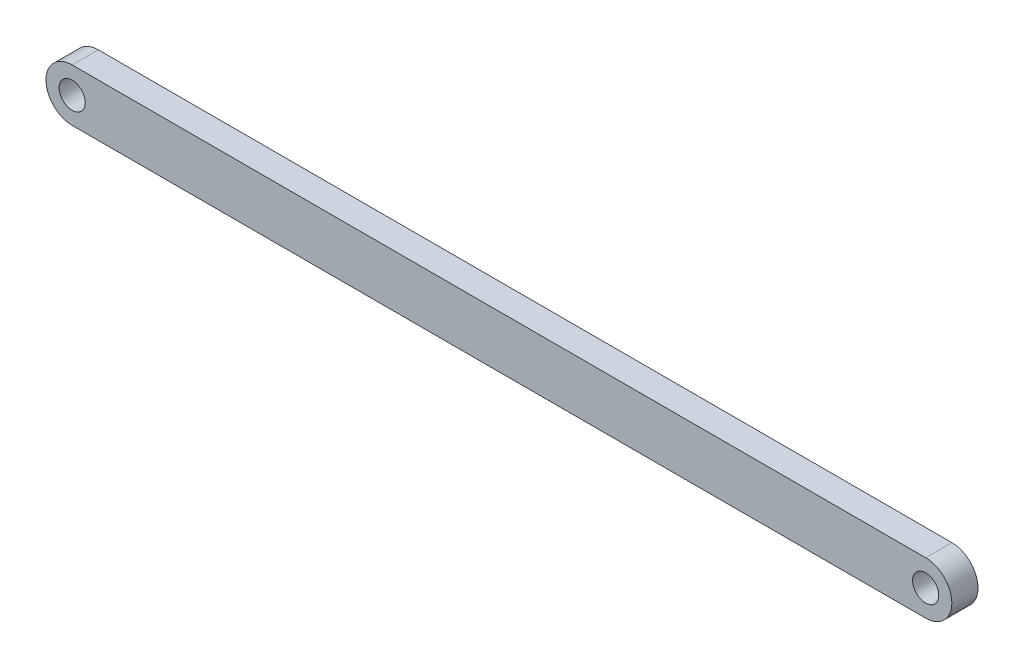
ISO-10303-21;
HEADER;
FILE_DESCRIPTION(('STEP AP214'),'2;1');
FILE_NAME('part.step','',(''),(''),'','','');
FILE_SCHEMA(('AUTOMOTIVE_DESIGN { 1 0 10303 214 1 1 1 1 }'));
ENDSEC;
DATA;
#1=APPLICATION_CONTEXT('core data for automotive mechanical design processes');
#2=APPLICATION_PROTOCOL_DEFINITION('international standard','automotive_design',2000,#1);
#3=PRODUCT_CONTEXT('',#1,'mechanical');
#4=PRODUCT('Part','Part','',(#3));
#5=PRODUCT_RELATED_PRODUCT_CATEGORY('part','',(#4));
#6=PRODUCT_DEFINITION_FORMATION('','',#4);
#7=PRODUCT_DEFINITION_CONTEXT('part definition',#1,'design');
#8=PRODUCT_DEFINITION('design','',#6,#7);
#9=PRODUCT_DEFINITION_SHAPE('','',#8);
#10=(LENGTH_UNIT() NAMED_UNIT(*) SI_UNIT(.MILLI.,.METRE.));
#11=(NAMED_UNIT(*) PLANE_ANGLE_UNIT() SI_UNIT($,.RADIAN.));
#12=(NAMED_UNIT(*) SI_UNIT($,.STERADIAN.) SOLID_ANGLE_UNIT());
#13=UNCERTAINTY_MEASURE_WITH_UNIT(LENGTH_MEASURE(1.E-05),#10,'distance_accuracy_value','');
#14=(GEOMETRIC_REPRESENTATION_CONTEXT(3) GLOBAL_UNCERTAINTY_ASSIGNED_CONTEXT((#13)) GLOBAL_UNIT_ASSIGNED_CONTEXT((#10,
#11,#12)) REPRESENTATION_CONTEXT('',''));
#15=CARTESIAN_POINT('',(0.,0.,0.));
#16=DIRECTION('',(0.,0.,1.));
#17=DIRECTION('',(1.,0.,0.));
#18=AXIS2_PLACEMENT_3D('',#15,#16,#17);
#19=CARTESIAN_POINT('',(0.,0.,5.));
#20=DIRECTION('',(0.,0.,1.));
#21=DIRECTION('',(1.,0.,0.));
#22=AXIS2_PLACEMENT_3D('',#19,#20,#21);
#23=PLANE('',#22);
#24=CARTESIAN_POINT('',(0.,0.,5.));
#25=DIRECTION('',(0.,0.,1.));
#26=DIRECTION('',(1.,0.,0.));
#27=AXIS2_PLACEMENT_3D('',#24,#25,#26);
#28=CIRCLE('',#27,2.5);
#29=CARTESIAN_POINT('',(2.5,0.,5.));
#30=VERTEX_POINT('',#29);
#31=EDGE_CURVE('E108',#30,#30,#28,.T.);
#32=ORIENTED_EDGE('',*,*,#31,.F.);
#33=EDGE_LOOP('',(#32));
#34=FACE_BOUND('',#33,.T.);
#35=CARTESIAN_POINT('',(0.,0.,5.));
#36=DIRECTION('',(0.,0.,1.));
#37=DIRECTION('',(1.,0.,0.));
#38=AXIS2_PLACEMENT_3D('',#35,#36,#37);
#39=CIRCLE('',#38,5.);
#40=CARTESIAN_POINT('',(0.,5.,5.));
#41=VERTEX_POINT('',#40);
#42=CARTESIAN_POINT('',(0.,-5.,5.));
#43=VERTEX_POINT('',#42);
#44=EDGE_CURVE('E93',#41,#43,#39,.T.);
#45=ORIENTED_EDGE('',*,*,#44,.T.);
#46=DIRECTION('',(1.,0.,0.));
#47=VECTOR('',#46,1.);
#48=CARTESIAN_POINT('',(0.,-5.,5.));
#49=LINE('',#48,#47);
#50=CARTESIAN_POINT('',(163.,-5.,5.));
#51=VERTEX_POINT('',#50);
#52=EDGE_CURVE('E88',#43,#51,#49,.T.);
#53=ORIENTED_EDGE('',*,*,#52,.T.);
#54=CARTESIAN_POINT('',(163.,0.,5.));
#55=DIRECTION('',(0.,0.,1.));
#56=DIRECTION('',(1.,0.,0.));
#57=AXIS2_PLACEMENT_3D('',#54,#55,#56);
#58=CIRCLE('',#57,5.);
#59=CARTESIAN_POINT('',(163.,5.,5.));
#60=VERTEX_POINT('',#59);
#61=EDGE_CURVE('E91',#51,#60,#58,.T.);
#62=ORIENTED_EDGE('',*,*,#61,.T.);
#63=DIRECTION('',(-1.,0.,0.));
#64=VECTOR('',#63,1.);
#65=CARTESIAN_POINT('',(0.,5.,5.));
#66=LINE('',#65,#64);
#67=EDGE_CURVE('E58',#60,#41,#66,.T.);
#68=ORIENTED_EDGE('',*,*,#67,.T.);
#69=EDGE_LOOP('',(#45,#53,#62,#68));
#70=FACE_BOUND('',#69,.T.);
#71=CARTESIAN_POINT('',(163.,0.,5.));
#72=DIRECTION('',(0.,0.,1.));
#73=DIRECTION('',(1.,0.,0.));
#74=AXIS2_PLACEMENT_3D('',#71,#72,#73);
#75=CIRCLE('',#74,2.5);
#76=CARTESIAN_POINT('',(165.5,0.,5.));
#77=VERTEX_POINT('',#76);
#78=EDGE_CURVE('E123',#77,#77,#75,.T.);
#79=ORIENTED_EDGE('',*,*,#78,.F.);
#80=EDGE_LOOP('',(#79));
#81=FACE_BOUND('',#80,.T.);
#82=ADVANCED_FACE('F41',(#34,#70,#81),#23,.T.);
#83=CARTESIAN_POINT('',(0.,0.,0.));
#84=DIRECTION('',(0.,0.,1.));
#85=DIRECTION('',(1.,0.,0.));
#86=AXIS2_PLACEMENT_3D('',#83,#84,#85);
#87=PLANE('',#86);
#88=CARTESIAN_POINT('',(0.,0.,0.));
#89=DIRECTION('',(0.,0.,1.));
#90=DIRECTION('',(1.,0.,0.));
#91=AXIS2_PLACEMENT_3D('',#88,#89,#90);
#92=CIRCLE('',#91,5.);
#93=CARTESIAN_POINT('',(0.,5.,0.));
#94=VERTEX_POINT('',#93);
#95=CARTESIAN_POINT('',(0.,-5.,0.));
#96=VERTEX_POINT('',#95);
#97=EDGE_CURVE('E105',#94,#96,#92,.T.);
#98=ORIENTED_EDGE('',*,*,#97,.F.);
#99=DIRECTION('',(-1.,0.,0.));
#100=VECTOR('',#99,1.);
#101=CARTESIAN_POINT('',(0.,5.,0.));
#102=LINE('',#101,#100);
#103=CARTESIAN_POINT('',(163.,5.,0.));
#104=VERTEX_POINT('',#103);
#105=EDGE_CURVE('E81',#104,#94,#102,.T.);
#106=ORIENTED_EDGE('',*,*,#105,.F.);
#107=CARTESIAN_POINT('',(163.,0.,0.));
#108=DIRECTION('',(0.,0.,1.));
#109=DIRECTION('',(1.,0.,0.));
#110=AXIS2_PLACEMENT_3D('',#107,#108,#109);
#111=CIRCLE('',#110,5.);
#112=CARTESIAN_POINT('',(163.,-5.,0.));
#113=VERTEX_POINT('',#112);
#114=EDGE_CURVE('E75',#113,#104,#111,.T.);
#115=ORIENTED_EDGE('',*,*,#114,.F.);
#116=DIRECTION('',(1.,0.,0.));
#117=VECTOR('',#116,1.);
#118=CARTESIAN_POINT('',(0.,-5.,0.));
#119=LINE('',#118,#117);
#120=EDGE_CURVE('E97',#96,#113,#119,.T.);
#121=ORIENTED_EDGE('',*,*,#120,.F.);
#122=EDGE_LOOP('',(#98,#106,#115,#121));
#123=FACE_BOUND('',#122,.T.);
#124=CARTESIAN_POINT('',(0.,0.,0.));
#125=DIRECTION('',(0.,0.,1.));
#126=DIRECTION('',(1.,0.,0.));
#127=AXIS2_PLACEMENT_3D('',#124,#125,#126);
#128=CIRCLE('',#127,2.5);
#129=CARTESIAN_POINT('',(2.5,0.,0.));
#130=VERTEX_POINT('',#129);
#131=EDGE_CURVE('E120',#130,#130,#128,.T.);
#132=ORIENTED_EDGE('',*,*,#131,.T.);
#133=EDGE_LOOP('',(#132));
#134=FACE_BOUND('',#133,.T.);
#135=CARTESIAN_POINT('',(163.,0.,0.));
#136=DIRECTION('',(0.,0.,1.));
#137=DIRECTION('',(1.,0.,0.));
#138=AXIS2_PLACEMENT_3D('',#135,#136,#137);
#139=CIRCLE('',#138,2.5);
#140=CARTESIAN_POINT('',(165.5,0.,0.));
#141=VERTEX_POINT('',#140);
#142=EDGE_CURVE('E126',#141,#141,#139,.T.);
#143=ORIENTED_EDGE('',*,*,#142,.T.);
#144=EDGE_LOOP('',(#143));
#145=FACE_BOUND('',#144,.T.);
#146=ADVANCED_FACE('F116',(#123,#134,#145),#87,.F.);
#147=CARTESIAN_POINT('',(0.,0.,5.));
#148=DIRECTION('',(0.,0.,-1.));
#149=DIRECTION('',(-1.,0.,0.));
#150=AXIS2_PLACEMENT_3D('',#147,#148,#149);
#151=CYLINDRICAL_SURFACE('',#150,5.);
#152=ORIENTED_EDGE('',*,*,#97,.T.);
#153=DIRECTION('',(0.,0.,-1.));
#154=VECTOR('',#153,1.);
#155=CARTESIAN_POINT('',(0.,-5.,5.));
#156=LINE('',#155,#154);
#157=EDGE_CURVE('E11',#43,#96,#156,.T.);
#158=ORIENTED_EDGE('',*,*,#157,.F.);
#159=ORIENTED_EDGE('',*,*,#44,.F.);
#160=DIRECTION('',(0.,0.,-1.));
#161=VECTOR('',#160,1.);
#162=CARTESIAN_POINT('',(0.,5.,5.));
#163=LINE('',#162,#161);
#164=EDGE_CURVE('E101',#41,#94,#163,.T.);
#165=ORIENTED_EDGE('',*,*,#164,.T.);
#166=EDGE_LOOP('',(#152,#158,#159,#165));
#167=FACE_BOUND('',#166,.T.);
#168=ADVANCED_FACE('F43',(#167),#151,.T.);
#169=CARTESIAN_POINT('',(0.,-5.,5.));
#170=DIRECTION('',(0.,1.,0.));
#171=DIRECTION('',(0.,0.,1.));
#172=AXIS2_PLACEMENT_3D('',#169,#170,#171);
#173=PLANE('',#172);
#174=ORIENTED_EDGE('',*,*,#120,.T.);
#175=DIRECTION('',(0.,0.,-1.));
#176=VECTOR('',#175,1.);
#177=CARTESIAN_POINT('',(163.,-5.,5.));
#178=LINE('',#177,#176);
#179=EDGE_CURVE('E50',#51,#113,#178,.T.);
#180=ORIENTED_EDGE('',*,*,#179,.F.);
#181=ORIENTED_EDGE('',*,*,#52,.F.);
#182=ORIENTED_EDGE('',*,*,#157,.T.);
#183=EDGE_LOOP('',(#174,#180,#181,#182));
#184=FACE_BOUND('',#183,.T.);
#185=ADVANCED_FACE('F96',(#184),#173,.F.);
#186=CARTESIAN_POINT('',(163.,0.,5.));
#187=DIRECTION('',(0.,0.,-1.));
#188=DIRECTION('',(-1.,0.,0.));
#189=AXIS2_PLACEMENT_3D('',#186,#187,#188);
#190=CYLINDRICAL_SURFACE('',#189,5.);
#191=ORIENTED_EDGE('',*,*,#114,.T.);
#192=DIRECTION('',(0.,0.,-1.));
#193=VECTOR('',#192,1.);
#194=CARTESIAN_POINT('',(163.,5.,5.));
#195=LINE('',#194,#193);
#196=EDGE_CURVE('E98',#60,#104,#195,.T.);
#197=ORIENTED_EDGE('',*,*,#196,.F.);
#198=ORIENTED_EDGE('',*,*,#61,.F.);
#199=ORIENTED_EDGE('',*,*,#179,.T.);
#200=EDGE_LOOP('',(#191,#197,#198,#199));
#201=FACE_BOUND('',#200,.T.);
#202=ADVANCED_FACE('F99',(#201),#190,.T.);
#203=CARTESIAN_POINT('',(0.,5.,5.));
#204=DIRECTION('',(0.,-1.,0.));
#205=DIRECTION('',(0.,0.,-1.));
#206=AXIS2_PLACEMENT_3D('',#203,#204,#205);
#207=PLANE('',#206);
#208=ORIENTED_EDGE('',*,*,#105,.T.);
#209=ORIENTED_EDGE('',*,*,#164,.F.);
#210=ORIENTED_EDGE('',*,*,#67,.F.);
#211=ORIENTED_EDGE('',*,*,#196,.T.);
#212=EDGE_LOOP('',(#208,#209,#210,#211));
#213=FACE_BOUND('',#212,.T.);
#214=ADVANCED_FACE('F113',(#213),#207,.F.);
#215=CARTESIAN_POINT('',(0.,0.,5.));
#216=DIRECTION('',(0.,0.,-1.));
#217=DIRECTION('',(-1.,0.,0.));
#218=AXIS2_PLACEMENT_3D('',#215,#216,#217);
#219=CYLINDRICAL_SURFACE('',#218,2.5);
#220=ORIENTED_EDGE('',*,*,#31,.T.);
#221=EDGE_LOOP('',(#220));
#222=FACE_BOUND('',#221,.T.);
#223=ORIENTED_EDGE('',*,*,#131,.F.);
#224=EDGE_LOOP('',(#223));
#225=FACE_BOUND('',#224,.T.);
#226=ADVANCED_FACE('F143',(#222,#225),#219,.F.);
#227=CARTESIAN_POINT('',(163.,0.,5.));
#228=DIRECTION('',(0.,0.,-1.));
#229=DIRECTION('',(-1.,0.,0.));
#230=AXIS2_PLACEMENT_3D('',#227,#228,#229);
#231=CYLINDRICAL_SURFACE('',#230,2.5);
#232=ORIENTED_EDGE('',*,*,#78,.T.);
#233=EDGE_LOOP('',(#232));
#234=FACE_BOUND('',#233,.T.);
#235=ORIENTED_EDGE('',*,*,#142,.F.);
#236=EDGE_LOOP('',(#235));
#237=FACE_BOUND('',#236,.T.);
#238=ADVANCED_FACE('F132',(#234,#237),#231,.F.);
#239=CLOSED_SHELL('',(#82,#146,#168,#185,#202,#214,#226,#238));
#240=MANIFOLD_SOLID_BREP('B2',#239);
#241=ADVANCED_BREP_SHAPE_REPRESENTATION('',(#18,#240),#14);
#242=SHAPE_DEFINITION_REPRESENTATION(#9,#241);
ENDSEC;
END-ISO-10303-21;
